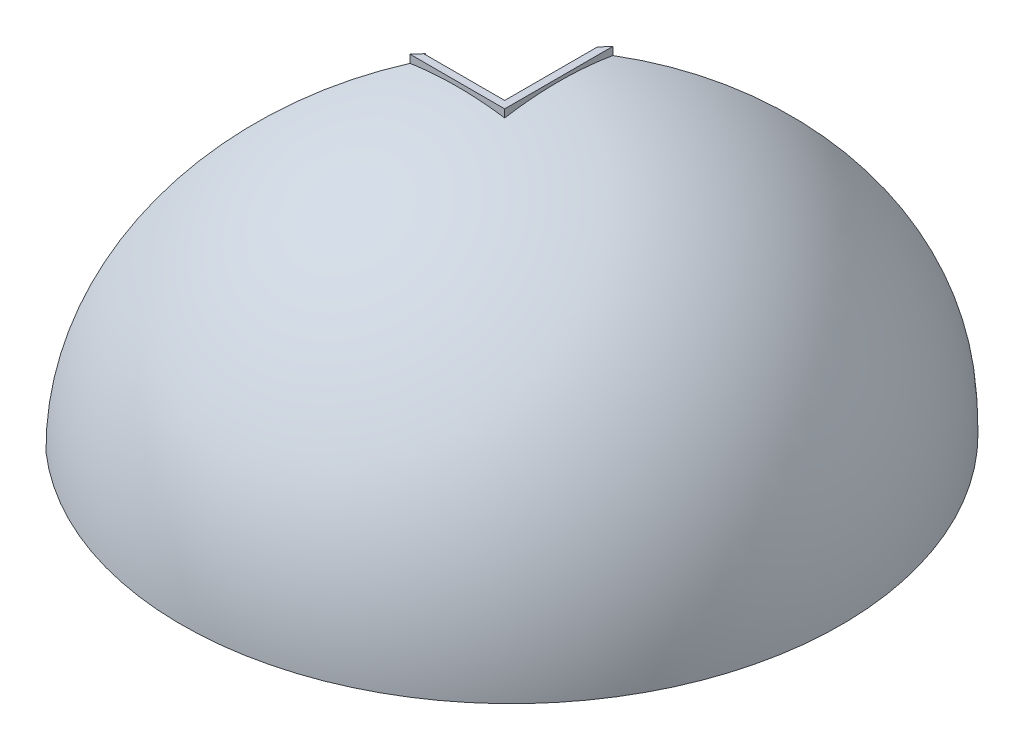
ISO-10303-21;
HEADER;
FILE_DESCRIPTION(('STEP AP214'),'2;1');
FILE_NAME('part.step','',(''),(''),'','','');
FILE_SCHEMA(('AUTOMOTIVE_DESIGN { 1 0 10303 214 1 1 1 1 }'));
ENDSEC;
DATA;
#1=APPLICATION_CONTEXT('core data for automotive mechanical design processes');
#2=APPLICATION_PROTOCOL_DEFINITION('international standard','automotive_design',2000,#1);
#3=PRODUCT_CONTEXT('',#1,'mechanical');
#4=PRODUCT('Part','Part','',(#3));
#5=PRODUCT_RELATED_PRODUCT_CATEGORY('part','',(#4));
#6=PRODUCT_DEFINITION_FORMATION('','',#4);
#7=PRODUCT_DEFINITION_CONTEXT('part definition',#1,'design');
#8=PRODUCT_DEFINITION('design','',#6,#7);
#9=PRODUCT_DEFINITION_SHAPE('','',#8);
#10=(LENGTH_UNIT() NAMED_UNIT(*) SI_UNIT(.MILLI.,.METRE.));
#11=(NAMED_UNIT(*) PLANE_ANGLE_UNIT() SI_UNIT($,.RADIAN.));
#12=(NAMED_UNIT(*) SI_UNIT($,.STERADIAN.) SOLID_ANGLE_UNIT());
#13=UNCERTAINTY_MEASURE_WITH_UNIT(LENGTH_MEASURE(1.E-05),#10,'distance_accuracy_value','');
#14=(GEOMETRIC_REPRESENTATION_CONTEXT(3) GLOBAL_UNCERTAINTY_ASSIGNED_CONTEXT((#13)) GLOBAL_UNIT_ASSIGNED_CONTEXT((#10,
#11,#12)) REPRESENTATION_CONTEXT('',''));
#15=CARTESIAN_POINT('',(0.,0.,0.));
#16=DIRECTION('',(0.,0.,1.));
#17=DIRECTION('',(1.,0.,0.));
#18=AXIS2_PLACEMENT_3D('',#15,#16,#17);
#19=CARTESIAN_POINT('',(0.,0.,0.));
#20=DIRECTION('',(-0.752785772217237,0.,-0.658265585571127));
#21=DIRECTION('',(-0.658265585571127,0.,0.752785772217237));
#22=AXIS2_PLACEMENT_3D('',#19,#20,#21);
#23=PLANE('',#22);
#24=DIRECTION('',(-0.658265585571127,0.,0.752785772217237));
#25=VECTOR('',#24,1.);
#26=CARTESIAN_POINT('',(0.,76.2,0.));
#27=LINE('',#26,#25);
#28=CARTESIAN_POINT('',(-8.24999999999999,76.2,9.43461538461538));
#29=VERTEX_POINT('',#28);
#30=CARTESIAN_POINT('',(-9.74999999999999,76.2,11.15));
#31=VERTEX_POINT('',#30);
#32=EDGE_CURVE('E193',#29,#31,#27,.T.);
#33=ORIENTED_EDGE('',*,*,#32,.F.);
#34=DIRECTION('',(0.,1.,0.));
#35=VECTOR('',#34,1.);
#36=CARTESIAN_POINT('',(-8.24999999999999,76.2,9.43461538461538));
#37=LINE('',#36,#35);
#38=CARTESIAN_POINT('',(-8.24999999999999,0.,9.43461538461538));
#39=VERTEX_POINT('',#38);
#40=EDGE_CURVE('E192',#39,#29,#37,.T.);
#41=ORIENTED_EDGE('',*,*,#40,.F.);
#42=DIRECTION('',(-0.658265585571127,0.,0.752785772217237));
#43=VECTOR('',#42,1.);
#44=CARTESIAN_POINT('',(0.,0.,0.));
#45=LINE('',#44,#43);
#46=CARTESIAN_POINT('',(-9.74999999999999,0.,11.15));
#47=VERTEX_POINT('',#46);
#48=EDGE_CURVE('E154',#39,#47,#45,.T.);
#49=ORIENTED_EDGE('',*,*,#48,.T.);
#50=DIRECTION('',(0.,-1.,0.));
#51=VECTOR('',#50,1.);
#52=CARTESIAN_POINT('',(-9.74999999999999,76.2,11.15));
#53=LINE('',#52,#51);
#54=CARTESIAN_POINT('',(-9.74999999999999,72.0039136223376,11.15));
#55=VERTEX_POINT('',#54);
#56=EDGE_CURVE('E60',#55,#47,#53,.T.);
#57=ORIENTED_EDGE('',*,*,#56,.F.);
#58=CARTESIAN_POINT('',(0.,8.17806906308015,0.));
#59=DIRECTION('',(-0.752785772217237,0.,-0.658265585571127));
#60=DIRECTION('',(-0.658265585571127,0.,0.752785772217237));
#61=AXIS2_PLACEMENT_3D('',#58,#59,#60);
#62=CIRCLE('',#61,65.5219309369199);
#63=CARTESIAN_POINT('',(-43.1292677623407,7.61999999999995,49.3221882615487));
#64=VERTEX_POINT('',#63);
#65=EDGE_CURVE('E189',#64,#55,#62,.T.);
#66=ORIENTED_EDGE('',*,*,#65,.F.);
#67=DIRECTION('',(0.658265585571127,0.,-0.752785772217237));
#68=VECTOR('',#67,1.);
#69=CARTESIAN_POINT('',(32.4670991376377,7.61999999999999,-37.1290415779138));
#70=LINE('',#69,#68);
#71=CARTESIAN_POINT('',(-44.7749892271084,7.61999999999995,51.2042184494624));
#72=VERTEX_POINT('',#71);
#73=EDGE_CURVE('E186',#72,#64,#70,.T.);
#74=ORIENTED_EDGE('',*,*,#73,.F.);
#75=CARTESIAN_POINT('',(0.,8.17806906308015,0.));
#76=DIRECTION('',(-0.752785772217237,0.,-0.658265585571127));
#77=DIRECTION('',(-0.658265585571127,0.,0.752785772217237));
#78=AXIS2_PLACEMENT_3D('',#75,#76,#77);
#79=CIRCLE('',#78,68.0219309369199);
#80=CARTESIAN_POINT('',(-9.74999999999999,74.5678129124662,11.15));
#81=VERTEX_POINT('',#80);
#82=EDGE_CURVE('E147',#81,#72,#79,.F.);
#83=ORIENTED_EDGE('',*,*,#82,.F.);
#84=EDGE_CURVE('E182',#31,#81,#53,.T.);
#85=ORIENTED_EDGE('',*,*,#84,.F.);
#86=EDGE_LOOP('',(#33,#41,#49,#57,#66,#74,#83,#85));
#87=FACE_BOUND('',#86,.T.);
#88=ADVANCED_FACE('F37',(#87),#23,.T.);
#89=CARTESIAN_POINT('',(9.74999999999999,76.2,-11.15));
#90=VERTEX_POINT('',#89);
#91=CARTESIAN_POINT('',(8.25,76.2,-9.43461538461539));
#92=VERTEX_POINT('',#91);
#93=EDGE_CURVE('E153',#90,#92,#27,.T.);
#94=ORIENTED_EDGE('',*,*,#93,.F.);
#95=DIRECTION('',(0.,-1.,0.));
#96=VECTOR('',#95,1.);
#97=CARTESIAN_POINT('',(9.74999999999999,76.2,-11.15));
#98=LINE('',#97,#96);
#99=CARTESIAN_POINT('',(9.74999999999999,74.5678129124662,-11.15));
#100=VERTEX_POINT('',#99);
#101=EDGE_CURVE('E132',#90,#100,#98,.T.);
#102=ORIENTED_EDGE('',*,*,#101,.T.);
#103=CARTESIAN_POINT('',(44.7749892271084,7.61999999999999,-51.2042184494624));
#104=VERTEX_POINT('',#103);
#105=EDGE_CURVE('E142',#104,#100,#79,.F.);
#106=ORIENTED_EDGE('',*,*,#105,.F.);
#107=CARTESIAN_POINT('',(43.1292677623407,7.61999999999999,-49.3221882615486));
#108=VERTEX_POINT('',#107);
#109=EDGE_CURVE('E184',#108,#104,#70,.T.);
#110=ORIENTED_EDGE('',*,*,#109,.F.);
#111=CARTESIAN_POINT('',(9.74999999999999,72.0039136223376,-11.15));
#112=VERTEX_POINT('',#111);
#113=EDGE_CURVE('E187',#112,#108,#62,.T.);
#114=ORIENTED_EDGE('',*,*,#113,.F.);
#115=CARTESIAN_POINT('',(9.74999999999999,0.,-11.15));
#116=VERTEX_POINT('',#115);
#117=EDGE_CURVE('E155',#112,#116,#98,.T.);
#118=ORIENTED_EDGE('',*,*,#117,.T.);
#119=CARTESIAN_POINT('',(8.25,0.,-9.43461538461539));
#120=VERTEX_POINT('',#119);
#121=EDGE_CURVE('E157',#116,#120,#45,.T.);
#122=ORIENTED_EDGE('',*,*,#121,.T.);
#123=DIRECTION('',(0.,-1.,0.));
#124=VECTOR('',#123,1.);
#125=CARTESIAN_POINT('',(8.25,76.2,-9.43461538461539));
#126=LINE('',#125,#124);
#127=EDGE_CURVE('E148',#92,#120,#126,.T.);
#128=ORIENTED_EDGE('',*,*,#127,.F.);
#129=EDGE_LOOP('',(#94,#102,#106,#110,#114,#118,#122,#128));
#130=FACE_BOUND('',#129,.T.);
#131=ADVANCED_FACE('F151',(#130),#23,.T.);
#132=CARTESIAN_POINT('',(-9.74999999999999,76.2,11.15));
#133=DIRECTION('',(0.,0.,-1.));
#134=DIRECTION('',(-1.,0.,0.));
#135=AXIS2_PLACEMENT_3D('',#132,#133,#134);
#136=PLANE('',#135);
#137=ORIENTED_EDGE('',*,*,#84,.T.);
#138=CARTESIAN_POINT('',(0.,8.17806906308015,11.15));
#139=DIRECTION('',(0.,0.,-1.));
#140=DIRECTION('',(-1.,0.,0.));
#141=AXIS2_PLACEMENT_3D('',#138,#139,#140);
#142=CIRCLE('',#141,67.101867249631);
#143=CARTESIAN_POINT('',(9.75,74.5678129124662,11.15));
#144=VERTEX_POINT('',#143);
#145=EDGE_CURVE('E138',#81,#144,#142,.T.);
#146=ORIENTED_EDGE('',*,*,#145,.T.);
#147=DIRECTION('',(0.,-1.,0.));
#148=VECTOR('',#147,1.);
#149=CARTESIAN_POINT('',(9.75,76.2,11.15));
#150=LINE('',#149,#148);
#151=CARTESIAN_POINT('',(9.75,76.2,11.15));
#152=VERTEX_POINT('',#151);
#153=EDGE_CURVE('E134',#152,#144,#150,.T.);
#154=ORIENTED_EDGE('',*,*,#153,.F.);
#155=DIRECTION('',(1.,0.,0.));
#156=VECTOR('',#155,1.);
#157=CARTESIAN_POINT('',(-9.74999999999999,76.2,11.15));
#158=LINE('',#157,#156);
#159=EDGE_CURVE('E240',#31,#152,#158,.T.);
#160=ORIENTED_EDGE('',*,*,#159,.F.);
#161=EDGE_LOOP('',(#137,#146,#154,#160));
#162=FACE_BOUND('',#161,.T.);
#163=ADVANCED_FACE('F226',(#162),#136,.F.);
#164=CARTESIAN_POINT('',(9.74999999999999,76.2,-11.15));
#165=DIRECTION('',(-1.,0.,0.));
#166=DIRECTION('',(0.,0.,1.));
#167=AXIS2_PLACEMENT_3D('',#164,#165,#166);
#168=PLANE('',#167);
#169=ORIENTED_EDGE('',*,*,#153,.T.);
#170=CARTESIAN_POINT('',(9.74999999999999,8.17806906308015,0.));
#171=DIRECTION('',(-1.,0.,0.));
#172=DIRECTION('',(0.,0.,1.));
#173=AXIS2_PLACEMENT_3D('',#170,#171,#172);
#174=CIRCLE('',#173,67.3195409104006);
#175=EDGE_CURVE('E127',#144,#100,#174,.T.);
#176=ORIENTED_EDGE('',*,*,#175,.T.);
#177=ORIENTED_EDGE('',*,*,#101,.F.);
#178=DIRECTION('',(0.,0.,-1.));
#179=VECTOR('',#178,1.);
#180=CARTESIAN_POINT('',(9.74999999999999,76.2,-11.15));
#181=LINE('',#180,#179);
#182=EDGE_CURVE('E238',#152,#90,#181,.T.);
#183=ORIENTED_EDGE('',*,*,#182,.F.);
#184=EDGE_LOOP('',(#169,#176,#177,#183));
#185=FACE_BOUND('',#184,.T.);
#186=ADVANCED_FACE('F129',(#185),#168,.F.);
#187=CARTESIAN_POINT('',(9.75,72.0039136223376,11.15));
#188=VERTEX_POINT('',#187);
#189=CARTESIAN_POINT('',(9.75,0.,11.15));
#190=VERTEX_POINT('',#189);
#191=EDGE_CURVE('E235',#188,#190,#150,.T.);
#192=ORIENTED_EDGE('',*,*,#191,.F.);
#193=CARTESIAN_POINT('',(0.,8.17806906308015,11.15));
#194=DIRECTION('',(0.,0.,-1.));
#195=DIRECTION('',(-1.,0.,0.));
#196=AXIS2_PLACEMENT_3D('',#193,#194,#195);
#197=CIRCLE('',#196,64.5662522816873);
#198=EDGE_CURVE('E52',#188,#55,#197,.F.);
#199=ORIENTED_EDGE('',*,*,#198,.T.);
#200=ORIENTED_EDGE('',*,*,#56,.T.);
#201=DIRECTION('',(1.,0.,0.));
#202=VECTOR('',#201,1.);
#203=CARTESIAN_POINT('',(-9.74999999999999,0.,11.15));
#204=LINE('',#203,#202);
#205=EDGE_CURVE('E237',#47,#190,#204,.T.);
#206=ORIENTED_EDGE('',*,*,#205,.T.);
#207=EDGE_LOOP('',(#192,#199,#200,#206));
#208=FACE_BOUND('',#207,.T.);
#209=ADVANCED_FACE('F233',(#208),#136,.F.);
#210=CARTESIAN_POINT('',(9.75,24.5378627889406,0.));
#211=DIRECTION('',(1.,0.,0.));
#212=DIRECTION('',(0.,0.,-1.));
#213=AXIS2_PLACEMENT_3D('',#210,#211,#212);
#214=CIRCLE('',#213,1.75);
#215=CARTESIAN_POINT('',(9.75,24.5378627889406,-1.75000000000001));
#216=VERTEX_POINT('',#215);
#217=EDGE_CURVE('E221',#216,#216,#214,.T.);
#218=ORIENTED_EDGE('',*,*,#217,.F.);
#219=EDGE_LOOP('',(#218));
#220=FACE_BOUND('',#219,.T.);
#221=CARTESIAN_POINT('',(9.75,52.0993544528044,0.));
#222=DIRECTION('',(1.,0.,0.));
#223=DIRECTION('',(0.,0.,-1.));
#224=AXIS2_PLACEMENT_3D('',#221,#222,#223);
#225=CIRCLE('',#224,1.75);
#226=CARTESIAN_POINT('',(9.75,52.0993544528044,-1.75));
#227=VERTEX_POINT('',#226);
#228=EDGE_CURVE('E218',#227,#227,#225,.T.);
#229=ORIENTED_EDGE('',*,*,#228,.F.);
#230=EDGE_LOOP('',(#229));
#231=FACE_BOUND('',#230,.T.);
#232=ORIENTED_EDGE('',*,*,#117,.F.);
#233=CARTESIAN_POINT('',(9.74999999999999,8.17806906308015,0.));
#234=DIRECTION('',(-1.,0.,0.));
#235=DIRECTION('',(0.,0.,1.));
#236=AXIS2_PLACEMENT_3D('',#233,#234,#235);
#237=CIRCLE('',#236,64.7924450356868);
#238=EDGE_CURVE('E175',#112,#188,#237,.F.);
#239=ORIENTED_EDGE('',*,*,#238,.T.);
#240=ORIENTED_EDGE('',*,*,#191,.T.);
#241=DIRECTION('',(0.,0.,-1.));
#242=VECTOR('',#241,1.);
#243=CARTESIAN_POINT('',(9.74999999999999,0.,-11.15));
#244=LINE('',#243,#242);
#245=EDGE_CURVE('E245',#190,#116,#244,.T.);
#246=ORIENTED_EDGE('',*,*,#245,.T.);
#247=EDGE_LOOP('',(#232,#239,#240,#246));
#248=FACE_BOUND('',#247,.T.);
#249=ADVANCED_FACE('F270',(#220,#231,#248),#168,.F.);
#250=CARTESIAN_POINT('',(0.,8.17806906308015,0.));
#251=DIRECTION('',(0.,1.,0.));
#252=DIRECTION('',(0.,0.,-1.));
#253=AXIS2_PLACEMENT_3D('',#250,#251,#252);
#254=SPHERICAL_SURFACE('',#253,65.5219309369199);
#255=ORIENTED_EDGE('',*,*,#238,.F.);
#256=ORIENTED_EDGE('',*,*,#113,.T.);
#257=CARTESIAN_POINT('',(0.,7.61999999999997,0.));
#258=DIRECTION('',(0.,1.,0.));
#259=DIRECTION('',(0.,0.,1.));
#260=AXIS2_PLACEMENT_3D('',#257,#258,#259);
#261=CIRCLE('',#260,65.519554276745);
#262=EDGE_CURVE('E11',#64,#108,#261,.T.);
#263=ORIENTED_EDGE('',*,*,#262,.F.);
#264=ORIENTED_EDGE('',*,*,#65,.T.);
#265=ORIENTED_EDGE('',*,*,#198,.F.);
#266=EDGE_LOOP('',(#255,#256,#263,#264,#265));
#267=FACE_BOUND('',#266,.T.);
#268=ADVANCED_FACE('F231',(#267),#254,.F.);
#269=CARTESIAN_POINT('',(0.,8.17806906308015,0.));
#270=DIRECTION('',(0.,1.,0.));
#271=DIRECTION('',(0.,0.,-1.));
#272=AXIS2_PLACEMENT_3D('',#269,#270,#271);
#273=SPHERICAL_SURFACE('',#272,68.0219309369199);
#274=CARTESIAN_POINT('',(0.,7.61999999999997,0.));
#275=DIRECTION('',(0.,1.,0.));
#276=DIRECTION('',(0.,0.,1.));
#277=AXIS2_PLACEMENT_3D('',#274,#275,#276);
#278=CIRCLE('',#277,68.019641628782);
#279=EDGE_CURVE('E45',#72,#104,#278,.T.);
#280=ORIENTED_EDGE('',*,*,#279,.T.);
#281=ORIENTED_EDGE('',*,*,#105,.T.);
#282=ORIENTED_EDGE('',*,*,#175,.F.);
#283=ORIENTED_EDGE('',*,*,#145,.F.);
#284=ORIENTED_EDGE('',*,*,#82,.T.);
#285=EDGE_LOOP('',(#280,#281,#282,#283,#284));
#286=FACE_BOUND('',#285,.T.);
#287=ADVANCED_FACE('F143',(#286),#273,.T.);
#288=CARTESIAN_POINT('',(0.,7.62,-65.519554276745));
#289=DIRECTION('',(0.,-1.,0.));
#290=DIRECTION('',(0.,0.,-1.));
#291=AXIS2_PLACEMENT_3D('',#288,#289,#290);
#292=PLANE('',#291);
#293=ORIENTED_EDGE('',*,*,#279,.F.);
#294=ORIENTED_EDGE('',*,*,#73,.T.);
#295=ORIENTED_EDGE('',*,*,#262,.T.);
#296=ORIENTED_EDGE('',*,*,#109,.T.);
#297=EDGE_LOOP('',(#293,#294,#295,#296));
#298=FACE_BOUND('',#297,.T.);
#299=ADVANCED_FACE('F39',(#298),#292,.T.);
#300=CARTESIAN_POINT('',(-8.24999999999999,76.2,9.65));
#301=DIRECTION('',(0.,0.,-1.));
#302=DIRECTION('',(-1.,0.,0.));
#303=AXIS2_PLACEMENT_3D('',#300,#301,#302);
#304=PLANE('',#303);
#305=DIRECTION('',(1.,0.,0.));
#306=VECTOR('',#305,1.);
#307=CARTESIAN_POINT('',(-8.24999999999999,0.,9.65));
#308=LINE('',#307,#306);
#309=CARTESIAN_POINT('',(-8.24999999999999,0.,9.65));
#310=VERTEX_POINT('',#309);
#311=CARTESIAN_POINT('',(8.25,0.,9.65));
#312=VERTEX_POINT('',#311);
#313=EDGE_CURVE('E172',#310,#312,#308,.T.);
#314=ORIENTED_EDGE('',*,*,#313,.F.);
#315=DIRECTION('',(0.,-1.,0.));
#316=VECTOR('',#315,1.);
#317=CARTESIAN_POINT('',(-8.24999999999999,76.2,9.65));
#318=LINE('',#317,#316);
#319=CARTESIAN_POINT('',(-8.24999999999999,76.2,9.65));
#320=VERTEX_POINT('',#319);
#321=EDGE_CURVE('E247',#320,#310,#318,.T.);
#322=ORIENTED_EDGE('',*,*,#321,.F.);
#323=DIRECTION('',(1.,0.,0.));
#324=VECTOR('',#323,1.);
#325=CARTESIAN_POINT('',(-8.24999999999999,76.2,9.65));
#326=LINE('',#325,#324);
#327=CARTESIAN_POINT('',(8.25,76.2,9.65));
#328=VERTEX_POINT('',#327);
#329=EDGE_CURVE('E165',#320,#328,#326,.T.);
#330=ORIENTED_EDGE('',*,*,#329,.T.);
#331=DIRECTION('',(0.,-1.,0.));
#332=VECTOR('',#331,1.);
#333=CARTESIAN_POINT('',(8.25,76.2,9.65));
#334=LINE('',#333,#332);
#335=EDGE_CURVE('E166',#328,#312,#334,.T.);
#336=ORIENTED_EDGE('',*,*,#335,.T.);
#337=EDGE_LOOP('',(#314,#322,#330,#336));
#338=FACE_BOUND('',#337,.T.);
#339=ADVANCED_FACE('F251',(#338),#304,.T.);
#340=CARTESIAN_POINT('',(0.,0.,0.));
#341=DIRECTION('',(0.,1.,0.));
#342=DIRECTION('',(0.,0.,1.));
#343=AXIS2_PLACEMENT_3D('',#340,#341,#342);
#344=PLANE('',#343);
#345=ORIENTED_EDGE('',*,*,#121,.F.);
#346=ORIENTED_EDGE('',*,*,#245,.F.);
#347=ORIENTED_EDGE('',*,*,#205,.F.);
#348=ORIENTED_EDGE('',*,*,#48,.F.);
#349=DIRECTION('',(0.,0.,1.));
#350=VECTOR('',#349,1.);
#351=CARTESIAN_POINT('',(-8.25,0.,-9.65));
#352=LINE('',#351,#350);
#353=EDGE_CURVE('E173',#39,#310,#352,.T.);
#354=ORIENTED_EDGE('',*,*,#353,.T.);
#355=ORIENTED_EDGE('',*,*,#313,.T.);
#356=DIRECTION('',(0.,0.,-1.));
#357=VECTOR('',#356,1.);
#358=CARTESIAN_POINT('',(8.25,0.,-9.65));
#359=LINE('',#358,#357);
#360=EDGE_CURVE('E169',#312,#120,#359,.T.);
#361=ORIENTED_EDGE('',*,*,#360,.T.);
#362=EDGE_LOOP('',(#345,#346,#347,#348,#354,#355,#361));
#363=FACE_BOUND('',#362,.T.);
#364=ADVANCED_FACE('F204',(#363),#344,.F.);
#365=CARTESIAN_POINT('',(0.,76.2,0.));
#366=DIRECTION('',(0.,1.,0.));
#367=DIRECTION('',(0.,0.,1.));
#368=AXIS2_PLACEMENT_3D('',#365,#366,#367);
#369=PLANE('',#368);
#370=ORIENTED_EDGE('',*,*,#182,.T.);
#371=ORIENTED_EDGE('',*,*,#93,.T.);
#372=DIRECTION('',(0.,0.,-1.));
#373=VECTOR('',#372,1.);
#374=CARTESIAN_POINT('',(8.25,76.2,-9.65));
#375=LINE('',#374,#373);
#376=EDGE_CURVE('E162',#328,#92,#375,.T.);
#377=ORIENTED_EDGE('',*,*,#376,.F.);
#378=ORIENTED_EDGE('',*,*,#329,.F.);
#379=DIRECTION('',(0.,0.,1.));
#380=VECTOR('',#379,1.);
#381=CARTESIAN_POINT('',(-8.25,76.2,-9.65));
#382=LINE('',#381,#380);
#383=EDGE_CURVE('E167',#29,#320,#382,.T.);
#384=ORIENTED_EDGE('',*,*,#383,.F.);
#385=ORIENTED_EDGE('',*,*,#32,.T.);
#386=ORIENTED_EDGE('',*,*,#159,.T.);
#387=EDGE_LOOP('',(#370,#371,#377,#378,#384,#385,#386));
#388=FACE_BOUND('',#387,.T.);
#389=ADVANCED_FACE('F210',(#388),#369,.T.);
#390=CARTESIAN_POINT('',(-2.95,52.0993544528044,0.));
#391=DIRECTION('',(1.,0.,0.));
#392=DIRECTION('',(0.,0.,-1.));
#393=AXIS2_PLACEMENT_3D('',#390,#391,#392);
#394=CYLINDRICAL_SURFACE('',#393,1.75);
#395=CARTESIAN_POINT('',(8.25,52.0993544528044,0.));
#396=DIRECTION('',(-1.,0.,0.));
#397=DIRECTION('',(0.,0.,1.));
#398=AXIS2_PLACEMENT_3D('',#395,#396,#397);
#399=CIRCLE('',#398,1.75);
#400=CARTESIAN_POINT('',(8.25,52.0993544528044,1.75));
#401=VERTEX_POINT('',#400);
#402=EDGE_CURVE('E224',#401,#401,#399,.T.);
#403=ORIENTED_EDGE('',*,*,#402,.T.);
#404=EDGE_LOOP('',(#403));
#405=FACE_BOUND('',#404,.T.);
#406=ORIENTED_EDGE('',*,*,#228,.T.);
#407=EDGE_LOOP('',(#406));
#408=FACE_BOUND('',#407,.T.);
#409=ADVANCED_FACE('F284',(#405,#408),#394,.F.);
#410=CARTESIAN_POINT('',(-2.95,24.5378627889406,0.));
#411=DIRECTION('',(1.,0.,0.));
#412=DIRECTION('',(0.,0.,-1.));
#413=AXIS2_PLACEMENT_3D('',#410,#411,#412);
#414=CYLINDRICAL_SURFACE('',#413,1.75);
#415=CARTESIAN_POINT('',(8.25,24.5378627889406,0.));
#416=DIRECTION('',(-1.,0.,0.));
#417=DIRECTION('',(0.,0.,1.));
#418=AXIS2_PLACEMENT_3D('',#415,#416,#417);
#419=CIRCLE('',#418,1.75);
#420=CARTESIAN_POINT('',(8.25,24.5378627889406,1.75));
#421=VERTEX_POINT('',#420);
#422=EDGE_CURVE('E174',#421,#421,#419,.T.);
#423=ORIENTED_EDGE('',*,*,#422,.T.);
#424=EDGE_LOOP('',(#423));
#425=FACE_BOUND('',#424,.T.);
#426=ORIENTED_EDGE('',*,*,#217,.T.);
#427=EDGE_LOOP('',(#426));
#428=FACE_BOUND('',#427,.T.);
#429=ADVANCED_FACE('F286',(#425,#428),#414,.F.);
#430=CARTESIAN_POINT('',(8.25,76.2,-9.65));
#431=DIRECTION('',(-1.,0.,0.));
#432=DIRECTION('',(0.,0.,1.));
#433=AXIS2_PLACEMENT_3D('',#430,#431,#432);
#434=PLANE('',#433);
#435=ORIENTED_EDGE('',*,*,#422,.F.);
#436=EDGE_LOOP('',(#435));
#437=FACE_BOUND('',#436,.T.);
#438=ORIENTED_EDGE('',*,*,#402,.F.);
#439=EDGE_LOOP('',(#438));
#440=FACE_BOUND('',#439,.T.);
#441=ORIENTED_EDGE('',*,*,#376,.T.);
#442=ORIENTED_EDGE('',*,*,#127,.T.);
#443=ORIENTED_EDGE('',*,*,#360,.F.);
#444=ORIENTED_EDGE('',*,*,#335,.F.);
#445=EDGE_LOOP('',(#441,#442,#443,#444));
#446=FACE_BOUND('',#445,.T.);
#447=ADVANCED_FACE('F208',(#437,#440,#446),#434,.T.);
#448=CARTESIAN_POINT('',(-8.25,76.2,-9.65));
#449=DIRECTION('',(1.,0.,0.));
#450=DIRECTION('',(0.,0.,-1.));
#451=AXIS2_PLACEMENT_3D('',#448,#449,#450);
#452=PLANE('',#451);
#453=ORIENTED_EDGE('',*,*,#353,.F.);
#454=ORIENTED_EDGE('',*,*,#40,.T.);
#455=ORIENTED_EDGE('',*,*,#383,.T.);
#456=ORIENTED_EDGE('',*,*,#321,.T.);
#457=EDGE_LOOP('',(#453,#454,#455,#456));
#458=FACE_BOUND('',#457,.T.);
#459=ADVANCED_FACE('F254',(#458),#452,.T.);
#460=CLOSED_SHELL('',(#88,#131,#163,#186,#209,#249,#268,#287,#299,#339,#364,#389,#409,#429,#447,#459));
#461=MANIFOLD_SOLID_BREP('B2',#460);
#462=ADVANCED_BREP_SHAPE_REPRESENTATION('',(#18,#461),#14);
#463=SHAPE_DEFINITION_REPRESENTATION(#9,#462);
ENDSEC;
END-ISO-10303-21;
